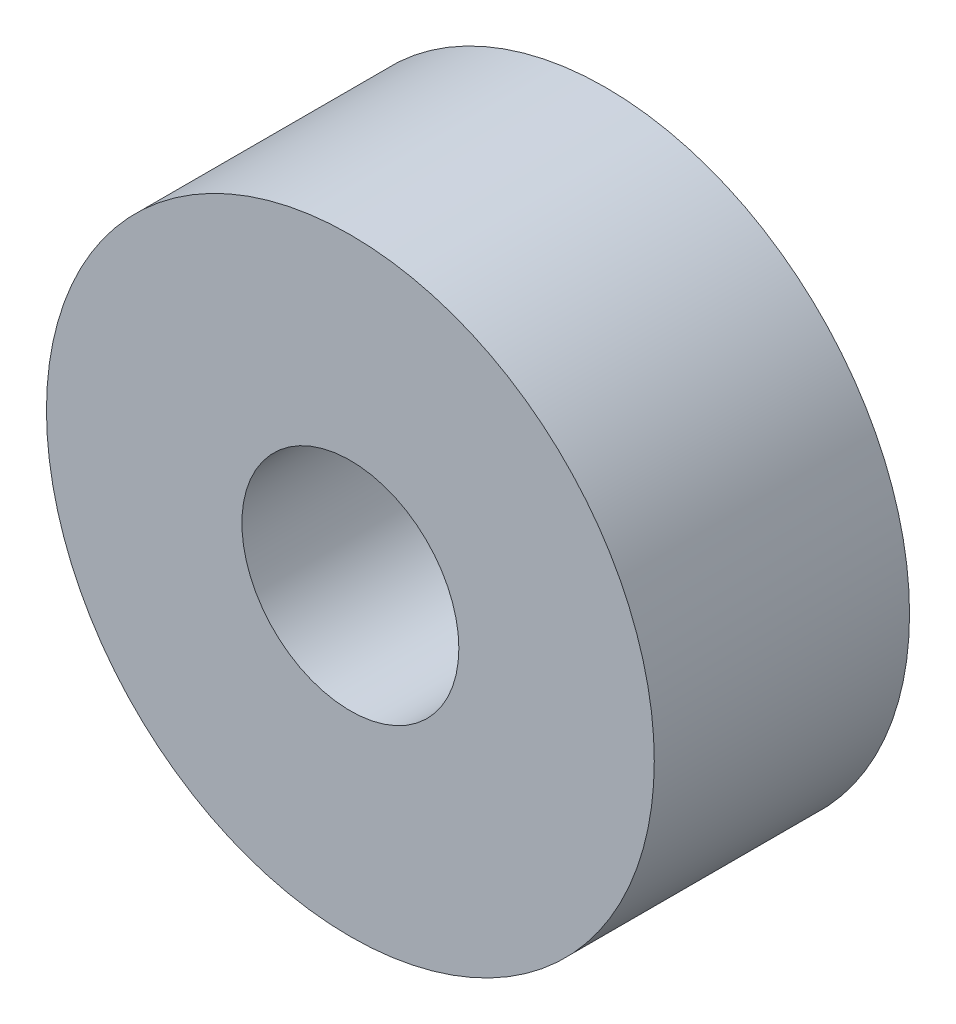
ISO-10303-21;
HEADER;
FILE_DESCRIPTION(('STEP AP214'),'2;1');
FILE_NAME('part.step','',(''),(''),'','','');
FILE_SCHEMA(('AUTOMOTIVE_DESIGN { 1 0 10303 214 1 1 1 1 }'));
ENDSEC;
DATA;
#1=APPLICATION_CONTEXT('core data for automotive mechanical design processes');
#2=APPLICATION_PROTOCOL_DEFINITION('international standard','automotive_design',2000,#1);
#3=PRODUCT_CONTEXT('',#1,'mechanical');
#4=PRODUCT('Part','Part','',(#3));
#5=PRODUCT_RELATED_PRODUCT_CATEGORY('part','',(#4));
#6=PRODUCT_DEFINITION_FORMATION('','',#4);
#7=PRODUCT_DEFINITION_CONTEXT('part definition',#1,'design');
#8=PRODUCT_DEFINITION('design','',#6,#7);
#9=PRODUCT_DEFINITION_SHAPE('','',#8);
#10=(LENGTH_UNIT() NAMED_UNIT(*) SI_UNIT(.MILLI.,.METRE.));
#11=(NAMED_UNIT(*) PLANE_ANGLE_UNIT() SI_UNIT($,.RADIAN.));
#12=(NAMED_UNIT(*) SI_UNIT($,.STERADIAN.) SOLID_ANGLE_UNIT());
#13=UNCERTAINTY_MEASURE_WITH_UNIT(LENGTH_MEASURE(1.E-05),#10,'distance_accuracy_value','');
#14=(GEOMETRIC_REPRESENTATION_CONTEXT(3) GLOBAL_UNCERTAINTY_ASSIGNED_CONTEXT((#13)) GLOBAL_UNIT_ASSIGNED_CONTEXT((#10,
#11,#12)) REPRESENTATION_CONTEXT('',''));
#15=CARTESIAN_POINT('',(0.,0.,0.));
#16=DIRECTION('',(0.,0.,1.));
#17=DIRECTION('',(1.,0.,0.));
#18=AXIS2_PLACEMENT_3D('',#15,#16,#17);
#19=CARTESIAN_POINT('',(-39.8934093706071,-58.2443913577909,4.));
#20=DIRECTION('',(0.,0.,-1.));
#21=DIRECTION('',(0.,-1.,0.));
#22=AXIS2_PLACEMENT_3D('',#19,#20,#21);
#23=PLANE('',#22);
#24=CARTESIAN_POINT('',(-91.8951761523299,-69.183415120827,4.));
#25=DIRECTION('',(0.,0.,1.));
#26=DIRECTION('',(1.,0.,0.));
#27=AXIS2_PLACEMENT_3D('',#24,#25,#26);
#28=CIRCLE('',#27,4.7625);
#29=CARTESIAN_POINT('',(-87.1326761523299,-69.183415120827,4.));
#30=VERTEX_POINT('',#29);
#31=EDGE_CURVE('E18',#30,#30,#28,.T.);
#32=ORIENTED_EDGE('',*,*,#31,.T.);
#33=EDGE_LOOP('',(#32));
#34=FACE_BOUND('',#33,.T.);
#35=CARTESIAN_POINT('',(-91.8951761523299,-69.183415120827,4.));
#36=DIRECTION('',(0.,0.,1.));
#37=DIRECTION('',(1.,0.,0.));
#38=AXIS2_PLACEMENT_3D('',#35,#36,#37);
#39=CIRCLE('',#38,1.7);
#40=CARTESIAN_POINT('',(-90.1951761523299,-69.183415120827,4.));
#41=VERTEX_POINT('',#40);
#42=EDGE_CURVE('E29',#41,#41,#39,.T.);
#43=ORIENTED_EDGE('',*,*,#42,.F.);
#44=EDGE_LOOP('',(#43));
#45=FACE_BOUND('',#44,.T.);
#46=ADVANCED_FACE('F15',(#34,#45),#23,.F.);
#47=CARTESIAN_POINT('',(-91.8951761523299,-69.183415120827,0.));
#48=DIRECTION('',(0.,0.,1.));
#49=DIRECTION('',(1.,0.,0.));
#50=AXIS2_PLACEMENT_3D('',#47,#48,#49);
#51=PLANE('',#50);
#52=CARTESIAN_POINT('',(-91.8951761523299,-69.183415120827,0.));
#53=DIRECTION('',(0.,0.,1.));
#54=DIRECTION('',(1.,0.,0.));
#55=AXIS2_PLACEMENT_3D('',#52,#53,#54);
#56=CIRCLE('',#55,1.7);
#57=CARTESIAN_POINT('',(-90.1951761523299,-69.183415120827,0.));
#58=VERTEX_POINT('',#57);
#59=EDGE_CURVE('E25',#58,#58,#56,.T.);
#60=ORIENTED_EDGE('',*,*,#59,.T.);
#61=EDGE_LOOP('',(#60));
#62=FACE_BOUND('',#61,.T.);
#63=CARTESIAN_POINT('',(-91.8951761523299,-69.183415120827,0.));
#64=DIRECTION('',(0.,0.,1.));
#65=DIRECTION('',(1.,0.,0.));
#66=AXIS2_PLACEMENT_3D('',#63,#64,#65);
#67=CIRCLE('',#66,4.7625);
#68=CARTESIAN_POINT('',(-87.1326761523299,-69.183415120827,0.));
#69=VERTEX_POINT('',#68);
#70=EDGE_CURVE('E10',#69,#69,#67,.T.);
#71=ORIENTED_EDGE('',*,*,#70,.F.);
#72=EDGE_LOOP('',(#71));
#73=FACE_BOUND('',#72,.T.);
#74=ADVANCED_FACE('F36',(#62,#73),#51,.F.);
#75=CARTESIAN_POINT('',(-91.8951761523299,-69.183415120827,0.));
#76=DIRECTION('',(0.,0.,1.));
#77=DIRECTION('',(1.,0.,0.));
#78=AXIS2_PLACEMENT_3D('',#75,#76,#77);
#79=CYLINDRICAL_SURFACE('',#78,4.7625);
#80=ORIENTED_EDGE('',*,*,#70,.T.);
#81=EDGE_LOOP('',(#80));
#82=FACE_BOUND('',#81,.T.);
#83=ORIENTED_EDGE('',*,*,#31,.F.);
#84=EDGE_LOOP('',(#83));
#85=FACE_BOUND('',#84,.T.);
#86=ADVANCED_FACE('F43',(#82,#85),#79,.T.);
#87=CARTESIAN_POINT('',(-91.8951761523299,-69.183415120827,4.));
#88=DIRECTION('',(0.,0.,1.));
#89=DIRECTION('',(1.,0.,0.));
#90=AXIS2_PLACEMENT_3D('',#87,#88,#89);
#91=CYLINDRICAL_SURFACE('',#90,1.7);
#92=ORIENTED_EDGE('',*,*,#59,.F.);
#93=EDGE_LOOP('',(#92));
#94=FACE_BOUND('',#93,.T.);
#95=ORIENTED_EDGE('',*,*,#42,.T.);
#96=EDGE_LOOP('',(#95));
#97=FACE_BOUND('',#96,.T.);
#98=ADVANCED_FACE('F33',(#94,#97),#91,.F.);
#99=CLOSED_SHELL('',(#46,#74,#86,#98));
#100=MANIFOLD_SOLID_BREP('B1',#99);
#101=ADVANCED_BREP_SHAPE_REPRESENTATION('',(#18,#100),#14);
#102=SHAPE_DEFINITION_REPRESENTATION(#9,#101);
ENDSEC;
END-ISO-10303-21;
